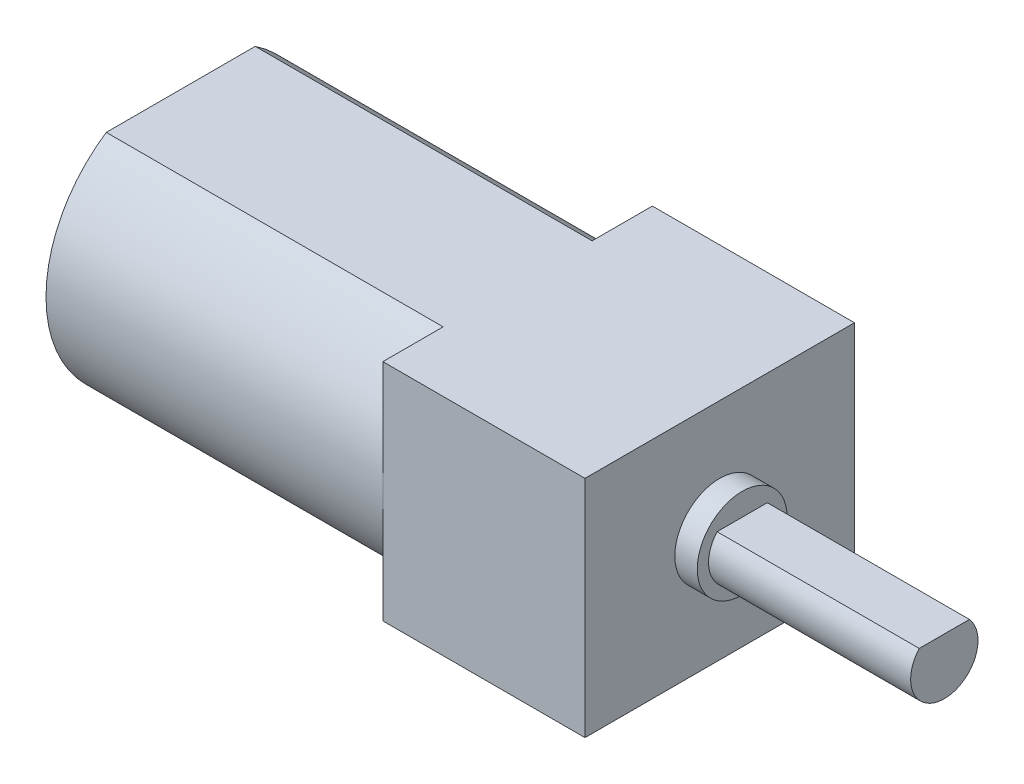
ISO-10303-21;
HEADER;
FILE_DESCRIPTION(('STEP AP214'),'2;1');
FILE_NAME('part.step','',(''),(''),'','','');
FILE_SCHEMA(('AUTOMOTIVE_DESIGN { 1 0 10303 214 1 1 1 1 }'));
ENDSEC;
DATA;
#1=APPLICATION_CONTEXT('core data for automotive mechanical design processes');
#2=APPLICATION_PROTOCOL_DEFINITION('international standard','automotive_design',2000,#1);
#3=PRODUCT_CONTEXT('',#1,'mechanical');
#4=PRODUCT('Part','Part','',(#3));
#5=PRODUCT_RELATED_PRODUCT_CATEGORY('part','',(#4));
#6=PRODUCT_DEFINITION_FORMATION('','',#4);
#7=PRODUCT_DEFINITION_CONTEXT('part definition',#1,'design');
#8=PRODUCT_DEFINITION('design','',#6,#7);
#9=PRODUCT_DEFINITION_SHAPE('','',#8);
#10=(LENGTH_UNIT() NAMED_UNIT(*) SI_UNIT(.MILLI.,.METRE.));
#11=(NAMED_UNIT(*) PLANE_ANGLE_UNIT() SI_UNIT($,.RADIAN.));
#12=(NAMED_UNIT(*) SI_UNIT($,.STERADIAN.) SOLID_ANGLE_UNIT());
#13=UNCERTAINTY_MEASURE_WITH_UNIT(LENGTH_MEASURE(1.E-05),#10,'distance_accuracy_value','');
#14=(GEOMETRIC_REPRESENTATION_CONTEXT(3) GLOBAL_UNCERTAINTY_ASSIGNED_CONTEXT((#13)) GLOBAL_UNIT_ASSIGNED_CONTEXT((#10,
#11,#12)) REPRESENTATION_CONTEXT('',''));
#15=CARTESIAN_POINT('',(0.,0.,0.));
#16=DIRECTION('',(0.,0.,1.));
#17=DIRECTION('',(1.,0.,0.));
#18=AXIS2_PLACEMENT_3D('',#15,#16,#17);
#19=CARTESIAN_POINT('',(13.,0.,0.));
#20=DIRECTION('',(1.,0.,0.));
#21=DIRECTION('',(0.,0.,-1.));
#22=AXIS2_PLACEMENT_3D('',#19,#20,#21);
#23=PLANE('',#22);
#24=CARTESIAN_POINT('',(13.,0.,0.));
#25=DIRECTION('',(1.,0.,0.));
#26=DIRECTION('',(0.,0.,-1.));
#27=AXIS2_PLACEMENT_3D('',#24,#25,#26);
#28=CIRCLE('',#27,2.);
#29=CARTESIAN_POINT('',(13.,0.,-2.));
#30=VERTEX_POINT('',#29);
#31=EDGE_CURVE('E161',#30,#30,#28,.T.);
#32=ORIENTED_EDGE('',*,*,#31,.T.);
#33=EDGE_LOOP('',(#32));
#34=FACE_BOUND('',#33,.T.);
#35=DIRECTION('',(0.,0.,-1.));
#36=VECTOR('',#35,1.);
#37=CARTESIAN_POINT('',(13.,1.,0.));
#38=LINE('',#37,#36);
#39=CARTESIAN_POINT('',(13.,1.,1.1180339887499));
#40=VERTEX_POINT('',#39);
#41=CARTESIAN_POINT('',(13.,1.,-1.11803398874989));
#42=VERTEX_POINT('',#41);
#43=EDGE_CURVE('E86',#40,#42,#38,.T.);
#44=ORIENTED_EDGE('',*,*,#43,.T.);
#45=CARTESIAN_POINT('',(13.,0.,0.));
#46=DIRECTION('',(1.,0.,0.));
#47=DIRECTION('',(0.,0.,-1.));
#48=AXIS2_PLACEMENT_3D('',#45,#46,#47);
#49=CIRCLE('',#48,1.5);
#50=EDGE_CURVE('E170',#40,#42,#49,.T.);
#51=ORIENTED_EDGE('',*,*,#50,.F.);
#52=EDGE_LOOP('',(#44,#51));
#53=FACE_BOUND('',#52,.T.);
#54=ADVANCED_FACE('F71',(#34,#53),#23,.T.);
#55=CARTESIAN_POINT('',(-12.,5.,-6.));
#56=DIRECTION('',(1.,0.,0.));
#57=DIRECTION('',(0.,0.,-1.));
#58=AXIS2_PLACEMENT_3D('',#55,#56,#57);
#59=PLANE('',#58);
#60=CARTESIAN_POINT('',(-12.,0.,0.));
#61=DIRECTION('',(1.,0.,0.));
#62=DIRECTION('',(0.,0.,-1.));
#63=AXIS2_PLACEMENT_3D('',#60,#61,#62);
#64=CIRCLE('',#63,2.5);
#65=CARTESIAN_POINT('',(-12.,0.,-2.5));
#66=VERTEX_POINT('',#65);
#67=EDGE_CURVE('E79',#66,#66,#64,.F.);
#68=ORIENTED_EDGE('',*,*,#67,.F.);
#69=EDGE_LOOP('',(#68));
#70=FACE_BOUND('',#69,.T.);
#71=DIRECTION('',(0.,0.,1.));
#72=VECTOR('',#71,1.);
#73=CARTESIAN_POINT('',(-12.,-5.,-6.));
#74=LINE('',#73,#72);
#75=CARTESIAN_POINT('',(-12.,-5.,-3.3166247903554));
#76=VERTEX_POINT('',#75);
#77=CARTESIAN_POINT('',(-12.,-5.,3.3166247903554));
#78=VERTEX_POINT('',#77);
#79=EDGE_CURVE('E243',#76,#78,#74,.T.);
#80=ORIENTED_EDGE('',*,*,#79,.T.);
#81=CARTESIAN_POINT('',(-12.,0.,0.));
#82=DIRECTION('',(-1.,0.,0.));
#83=DIRECTION('',(0.,0.,1.));
#84=AXIS2_PLACEMENT_3D('',#81,#82,#83);
#85=CIRCLE('',#84,6.);
#86=CARTESIAN_POINT('',(-12.,5.,3.3166247903554));
#87=VERTEX_POINT('',#86);
#88=EDGE_CURVE('E189',#78,#87,#85,.T.);
#89=ORIENTED_EDGE('',*,*,#88,.T.);
#90=DIRECTION('',(0.,0.,1.));
#91=VECTOR('',#90,1.);
#92=CARTESIAN_POINT('',(-12.,5.,-6.));
#93=LINE('',#92,#91);
#94=CARTESIAN_POINT('',(-12.,5.,-3.3166247903554));
#95=VERTEX_POINT('',#94);
#96=EDGE_CURVE('E232',#95,#87,#93,.T.);
#97=ORIENTED_EDGE('',*,*,#96,.F.);
#98=CARTESIAN_POINT('',(-12.,0.,0.));
#99=DIRECTION('',(-1.,0.,0.));
#100=DIRECTION('',(0.,0.,1.));
#101=AXIS2_PLACEMENT_3D('',#98,#99,#100);
#102=CIRCLE('',#101,6.);
#103=EDGE_CURVE('E211',#95,#76,#102,.T.);
#104=ORIENTED_EDGE('',*,*,#103,.T.);
#105=EDGE_LOOP('',(#80,#89,#97,#104));
#106=FACE_BOUND('',#105,.T.);
#107=ADVANCED_FACE('F256',(#70,#106),#59,.F.);
#108=CARTESIAN_POINT('',(0.,-5.,0.));
#109=DIRECTION('',(0.,1.,0.));
#110=DIRECTION('',(0.,0.,1.));
#111=AXIS2_PLACEMENT_3D('',#108,#109,#110);
#112=PLANE('',#111);
#113=DIRECTION('',(-1.,0.,0.));
#114=VECTOR('',#113,1.);
#115=CARTESIAN_POINT('',(3.,-5.,3.3166247903554));
#116=LINE('',#115,#114);
#117=CARTESIAN_POINT('',(3.,-5.,3.3166247903554));
#118=VERTEX_POINT('',#117);
#119=EDGE_CURVE('E181',#118,#78,#116,.T.);
#120=ORIENTED_EDGE('',*,*,#119,.T.);
#121=ORIENTED_EDGE('',*,*,#79,.F.);
#122=DIRECTION('',(-1.,0.,0.));
#123=VECTOR('',#122,1.);
#124=CARTESIAN_POINT('',(3.,-5.,-3.3166247903554));
#125=LINE('',#124,#123);
#126=CARTESIAN_POINT('',(3.,-5.,-3.3166247903554));
#127=VERTEX_POINT('',#126);
#128=EDGE_CURVE('E202',#127,#76,#125,.T.);
#129=ORIENTED_EDGE('',*,*,#128,.F.);
#130=DIRECTION('',(0.,0.,1.));
#131=VECTOR('',#130,1.);
#132=CARTESIAN_POINT('',(3.,-5.,0.));
#133=LINE('',#132,#131);
#134=CARTESIAN_POINT('',(3.,-5.,-6.));
#135=VERTEX_POINT('',#134);
#136=EDGE_CURVE('E201',#135,#127,#133,.T.);
#137=ORIENTED_EDGE('',*,*,#136,.F.);
#138=DIRECTION('',(-1.,0.,0.));
#139=VECTOR('',#138,1.);
#140=CARTESIAN_POINT('',(-12.,-5.,-6.));
#141=LINE('',#140,#139);
#142=CARTESIAN_POINT('',(12.,-5.,-6.));
#143=VERTEX_POINT('',#142);
#144=EDGE_CURVE('E240',#143,#135,#141,.T.);
#145=ORIENTED_EDGE('',*,*,#144,.F.);
#146=DIRECTION('',(0.,0.,-1.));
#147=VECTOR('',#146,1.);
#148=CARTESIAN_POINT('',(12.,-5.,-6.));
#149=LINE('',#148,#147);
#150=CARTESIAN_POINT('',(12.,-5.,6.));
#151=VERTEX_POINT('',#150);
#152=EDGE_CURVE('E224',#151,#143,#149,.T.);
#153=ORIENTED_EDGE('',*,*,#152,.F.);
#154=DIRECTION('',(1.,0.,0.));
#155=VECTOR('',#154,1.);
#156=CARTESIAN_POINT('',(-12.,-5.,6.));
#157=LINE('',#156,#155);
#158=CARTESIAN_POINT('',(3.,-5.,6.));
#159=VERTEX_POINT('',#158);
#160=EDGE_CURVE('E229',#159,#151,#157,.T.);
#161=ORIENTED_EDGE('',*,*,#160,.F.);
#162=DIRECTION('',(0.,0.,1.));
#163=VECTOR('',#162,1.);
#164=CARTESIAN_POINT('',(3.,-5.,0.));
#165=LINE('',#164,#163);
#166=EDGE_CURVE('E185',#118,#159,#165,.T.);
#167=ORIENTED_EDGE('',*,*,#166,.F.);
#168=EDGE_LOOP('',(#120,#121,#129,#137,#145,#153,#161,#167));
#169=FACE_BOUND('',#168,.T.);
#170=ADVANCED_FACE('F259',(#169),#112,.F.);
#171=CARTESIAN_POINT('',(-12.,5.,6.));
#172=DIRECTION('',(0.,0.,-1.));
#173=DIRECTION('',(-1.,0.,0.));
#174=AXIS2_PLACEMENT_3D('',#171,#172,#173);
#175=PLANE('',#174);
#176=DIRECTION('',(0.,1.,0.));
#177=VECTOR('',#176,1.);
#178=CARTESIAN_POINT('',(3.,0.,6.));
#179=LINE('',#178,#177);
#180=CARTESIAN_POINT('',(3.,0.,6.));
#181=VERTEX_POINT('',#180);
#182=EDGE_CURVE('E94',#159,#181,#179,.T.);
#183=ORIENTED_EDGE('',*,*,#182,.F.);
#184=ORIENTED_EDGE('',*,*,#160,.T.);
#185=DIRECTION('',(0.,-1.,0.));
#186=VECTOR('',#185,1.);
#187=CARTESIAN_POINT('',(12.,5.,6.));
#188=LINE('',#187,#186);
#189=CARTESIAN_POINT('',(12.,5.,6.));
#190=VERTEX_POINT('',#189);
#191=EDGE_CURVE('E237',#190,#151,#188,.T.);
#192=ORIENTED_EDGE('',*,*,#191,.F.);
#193=DIRECTION('',(1.,0.,0.));
#194=VECTOR('',#193,1.);
#195=CARTESIAN_POINT('',(-12.,5.,6.));
#196=LINE('',#195,#194);
#197=CARTESIAN_POINT('',(3.,5.,6.));
#198=VERTEX_POINT('',#197);
#199=EDGE_CURVE('E235',#198,#190,#196,.T.);
#200=ORIENTED_EDGE('',*,*,#199,.F.);
#201=DIRECTION('',(0.,1.,0.));
#202=VECTOR('',#201,1.);
#203=CARTESIAN_POINT('',(3.,0.,6.));
#204=LINE('',#203,#202);
#205=EDGE_CURVE('E192',#181,#198,#204,.T.);
#206=ORIENTED_EDGE('',*,*,#205,.F.);
#207=EDGE_LOOP('',(#183,#184,#192,#200,#206));
#208=FACE_BOUND('',#207,.T.);
#209=ADVANCED_FACE('F274',(#208),#175,.F.);
#210=CARTESIAN_POINT('',(0.,5.,0.));
#211=DIRECTION('',(0.,1.,0.));
#212=DIRECTION('',(0.,0.,1.));
#213=AXIS2_PLACEMENT_3D('',#210,#211,#212);
#214=PLANE('',#213);
#215=ORIENTED_EDGE('',*,*,#96,.T.);
#216=DIRECTION('',(-1.,0.,0.));
#217=VECTOR('',#216,1.);
#218=CARTESIAN_POINT('',(3.,5.,3.3166247903554));
#219=LINE('',#218,#217);
#220=CARTESIAN_POINT('',(3.,5.,3.3166247903554));
#221=VERTEX_POINT('',#220);
#222=EDGE_CURVE('E197',#221,#87,#219,.T.);
#223=ORIENTED_EDGE('',*,*,#222,.F.);
#224=DIRECTION('',(0.,0.,-1.));
#225=VECTOR('',#224,1.);
#226=CARTESIAN_POINT('',(3.,5.,0.));
#227=LINE('',#226,#225);
#228=EDGE_CURVE('E194',#198,#221,#227,.T.);
#229=ORIENTED_EDGE('',*,*,#228,.F.);
#230=ORIENTED_EDGE('',*,*,#199,.T.);
#231=DIRECTION('',(0.,0.,-1.));
#232=VECTOR('',#231,1.);
#233=CARTESIAN_POINT('',(12.,5.,-6.));
#234=LINE('',#233,#232);
#235=CARTESIAN_POINT('',(12.,5.,-6.));
#236=VERTEX_POINT('',#235);
#237=EDGE_CURVE('E225',#190,#236,#234,.T.);
#238=ORIENTED_EDGE('',*,*,#237,.T.);
#239=DIRECTION('',(-1.,0.,0.));
#240=VECTOR('',#239,1.);
#241=CARTESIAN_POINT('',(-12.,5.,-6.));
#242=LINE('',#241,#240);
#243=CARTESIAN_POINT('',(3.,5.,-6.));
#244=VERTEX_POINT('',#243);
#245=EDGE_CURVE('E228',#236,#244,#242,.T.);
#246=ORIENTED_EDGE('',*,*,#245,.T.);
#247=DIRECTION('',(0.,0.,-1.));
#248=VECTOR('',#247,1.);
#249=CARTESIAN_POINT('',(3.,5.,0.));
#250=LINE('',#249,#248);
#251=CARTESIAN_POINT('',(3.,5.,-3.3166247903554));
#252=VERTEX_POINT('',#251);
#253=EDGE_CURVE('E215',#252,#244,#250,.T.);
#254=ORIENTED_EDGE('',*,*,#253,.F.);
#255=DIRECTION('',(-1.,0.,0.));
#256=VECTOR('',#255,1.);
#257=CARTESIAN_POINT('',(3.,5.,-3.3166247903554));
#258=LINE('',#257,#256);
#259=EDGE_CURVE('E220',#252,#95,#258,.T.);
#260=ORIENTED_EDGE('',*,*,#259,.T.);
#261=EDGE_LOOP('',(#215,#223,#229,#230,#238,#246,#254,#260));
#262=FACE_BOUND('',#261,.T.);
#263=ADVANCED_FACE('F283',(#262),#214,.T.);
#264=CARTESIAN_POINT('',(-12.,5.,-6.));
#265=DIRECTION('',(0.,0.,1.));
#266=DIRECTION('',(1.,0.,0.));
#267=AXIS2_PLACEMENT_3D('',#264,#265,#266);
#268=PLANE('',#267);
#269=DIRECTION('',(0.,-1.,0.));
#270=VECTOR('',#269,1.);
#271=CARTESIAN_POINT('',(3.,0.,-6.));
#272=LINE('',#271,#270);
#273=CARTESIAN_POINT('',(3.,0.,-6.));
#274=VERTEX_POINT('',#273);
#275=EDGE_CURVE('E205',#274,#135,#272,.T.);
#276=ORIENTED_EDGE('',*,*,#275,.F.);
#277=DIRECTION('',(0.,-1.,0.));
#278=VECTOR('',#277,1.);
#279=CARTESIAN_POINT('',(3.,0.,-6.));
#280=LINE('',#279,#278);
#281=EDGE_CURVE('E217',#244,#274,#280,.T.);
#282=ORIENTED_EDGE('',*,*,#281,.F.);
#283=ORIENTED_EDGE('',*,*,#245,.F.);
#284=DIRECTION('',(0.,-1.,0.));
#285=VECTOR('',#284,1.);
#286=CARTESIAN_POINT('',(12.,5.,-6.));
#287=LINE('',#286,#285);
#288=EDGE_CURVE('E249',#236,#143,#287,.T.);
#289=ORIENTED_EDGE('',*,*,#288,.T.);
#290=ORIENTED_EDGE('',*,*,#144,.T.);
#291=EDGE_LOOP('',(#276,#282,#283,#289,#290));
#292=FACE_BOUND('',#291,.T.);
#293=ADVANCED_FACE('F413',(#292),#268,.F.);
#294=CARTESIAN_POINT('',(12.,5.,-6.));
#295=DIRECTION('',(-1.,0.,0.));
#296=DIRECTION('',(0.,0.,1.));
#297=AXIS2_PLACEMENT_3D('',#294,#295,#296);
#298=PLANE('',#297);
#299=CARTESIAN_POINT('',(12.,0.,0.));
#300=DIRECTION('',(-1.,0.,0.));
#301=DIRECTION('',(0.,0.,1.));
#302=AXIS2_PLACEMENT_3D('',#299,#300,#301);
#303=CIRCLE('',#302,2.);
#304=CARTESIAN_POINT('',(12.,0.,2.));
#305=VERTEX_POINT('',#304);
#306=EDGE_CURVE('E12',#305,#305,#303,.F.);
#307=ORIENTED_EDGE('',*,*,#306,.F.);
#308=EDGE_LOOP('',(#307));
#309=FACE_BOUND('',#308,.T.);
#310=ORIENTED_EDGE('',*,*,#152,.T.);
#311=ORIENTED_EDGE('',*,*,#288,.F.);
#312=ORIENTED_EDGE('',*,*,#237,.F.);
#313=ORIENTED_EDGE('',*,*,#191,.T.);
#314=EDGE_LOOP('',(#310,#311,#312,#313));
#315=FACE_BOUND('',#314,.T.);
#316=ADVANCED_FACE('F73',(#309,#315),#298,.F.);
#317=CARTESIAN_POINT('',(3.,0.,0.));
#318=DIRECTION('',(-1.,0.,0.));
#319=DIRECTION('',(0.,0.,1.));
#320=AXIS2_PLACEMENT_3D('',#317,#318,#319);
#321=CYLINDRICAL_SURFACE('',#320,6.);
#322=ORIENTED_EDGE('',*,*,#103,.F.);
#323=ORIENTED_EDGE('',*,*,#259,.F.);
#324=CARTESIAN_POINT('',(3.,0.,0.));
#325=DIRECTION('',(-1.,0.,0.));
#326=DIRECTION('',(0.,0.,1.));
#327=AXIS2_PLACEMENT_3D('',#324,#325,#326);
#328=CIRCLE('',#327,6.);
#329=EDGE_CURVE('E212',#252,#274,#328,.T.);
#330=ORIENTED_EDGE('',*,*,#329,.T.);
#331=CARTESIAN_POINT('',(3.,0.,0.));
#332=DIRECTION('',(-1.,0.,0.));
#333=DIRECTION('',(0.,0.,1.));
#334=AXIS2_PLACEMENT_3D('',#331,#332,#333);
#335=CIRCLE('',#334,6.);
#336=EDGE_CURVE('E209',#274,#127,#335,.T.);
#337=ORIENTED_EDGE('',*,*,#336,.T.);
#338=ORIENTED_EDGE('',*,*,#128,.T.);
#339=EDGE_LOOP('',(#322,#323,#330,#337,#338));
#340=FACE_BOUND('',#339,.T.);
#341=ADVANCED_FACE('F396',(#340),#321,.T.);
#342=CARTESIAN_POINT('',(3.,0.,0.));
#343=DIRECTION('',(-1.,0.,0.));
#344=DIRECTION('',(0.,0.,1.));
#345=AXIS2_PLACEMENT_3D('',#342,#343,#344);
#346=PLANE('',#345);
#347=ORIENTED_EDGE('',*,*,#329,.F.);
#348=ORIENTED_EDGE('',*,*,#253,.T.);
#349=ORIENTED_EDGE('',*,*,#281,.T.);
#350=EDGE_LOOP('',(#347,#348,#349));
#351=FACE_BOUND('',#350,.T.);
#352=ADVANCED_FACE('F386',(#351),#346,.T.);
#353=CARTESIAN_POINT('',(3.,0.,0.));
#354=DIRECTION('',(-1.,0.,0.));
#355=DIRECTION('',(0.,0.,1.));
#356=AXIS2_PLACEMENT_3D('',#353,#354,#355);
#357=PLANE('',#356);
#358=ORIENTED_EDGE('',*,*,#336,.F.);
#359=ORIENTED_EDGE('',*,*,#275,.T.);
#360=ORIENTED_EDGE('',*,*,#136,.T.);
#361=EDGE_LOOP('',(#358,#359,#360));
#362=FACE_BOUND('',#361,.T.);
#363=ADVANCED_FACE('F294',(#362),#357,.T.);
#364=CARTESIAN_POINT('',(3.,0.,0.));
#365=DIRECTION('',(-1.,0.,0.));
#366=DIRECTION('',(0.,0.,1.));
#367=AXIS2_PLACEMENT_3D('',#364,#365,#366);
#368=CYLINDRICAL_SURFACE('',#367,6.);
#369=ORIENTED_EDGE('',*,*,#88,.F.);
#370=ORIENTED_EDGE('',*,*,#119,.F.);
#371=CARTESIAN_POINT('',(3.,0.,0.));
#372=DIRECTION('',(-1.,0.,0.));
#373=DIRECTION('',(0.,0.,1.));
#374=AXIS2_PLACEMENT_3D('',#371,#372,#373);
#375=CIRCLE('',#374,6.);
#376=EDGE_CURVE('E187',#118,#181,#375,.T.);
#377=ORIENTED_EDGE('',*,*,#376,.T.);
#378=CARTESIAN_POINT('',(3.,0.,0.));
#379=DIRECTION('',(-1.,0.,0.));
#380=DIRECTION('',(0.,0.,1.));
#381=AXIS2_PLACEMENT_3D('',#378,#379,#380);
#382=CIRCLE('',#381,6.);
#383=EDGE_CURVE('E190',#181,#221,#382,.T.);
#384=ORIENTED_EDGE('',*,*,#383,.T.);
#385=ORIENTED_EDGE('',*,*,#222,.T.);
#386=EDGE_LOOP('',(#369,#370,#377,#384,#385));
#387=FACE_BOUND('',#386,.T.);
#388=ADVANCED_FACE('F269',(#387),#368,.T.);
#389=CARTESIAN_POINT('',(3.,0.,0.));
#390=DIRECTION('',(-1.,0.,0.));
#391=DIRECTION('',(0.,0.,1.));
#392=AXIS2_PLACEMENT_3D('',#389,#390,#391);
#393=PLANE('',#392);
#394=ORIENTED_EDGE('',*,*,#383,.F.);
#395=ORIENTED_EDGE('',*,*,#205,.T.);
#396=ORIENTED_EDGE('',*,*,#228,.T.);
#397=EDGE_LOOP('',(#394,#395,#396));
#398=FACE_BOUND('',#397,.T.);
#399=ADVANCED_FACE('F286',(#398),#393,.T.);
#400=CARTESIAN_POINT('',(3.,0.,0.));
#401=DIRECTION('',(-1.,0.,0.));
#402=DIRECTION('',(0.,0.,1.));
#403=AXIS2_PLACEMENT_3D('',#400,#401,#402);
#404=PLANE('',#403);
#405=ORIENTED_EDGE('',*,*,#376,.F.);
#406=ORIENTED_EDGE('',*,*,#166,.T.);
#407=ORIENTED_EDGE('',*,*,#182,.T.);
#408=EDGE_LOOP('',(#405,#406,#407));
#409=FACE_BOUND('',#408,.T.);
#410=ADVANCED_FACE('F271',(#409),#404,.T.);
#411=CARTESIAN_POINT('',(-13.5,0.,0.));
#412=DIRECTION('',(1.,0.,0.));
#413=DIRECTION('',(0.,0.,-1.));
#414=AXIS2_PLACEMENT_3D('',#411,#412,#413);
#415=CYLINDRICAL_SURFACE('',#414,2.5);
#416=CARTESIAN_POINT('',(-13.5,0.,0.));
#417=DIRECTION('',(-1.,0.,0.));
#418=DIRECTION('',(0.,0.,1.));
#419=AXIS2_PLACEMENT_3D('',#416,#417,#418);
#420=CIRCLE('',#419,2.5);
#421=CARTESIAN_POINT('',(-13.5,0.,2.5));
#422=VERTEX_POINT('',#421);
#423=EDGE_CURVE('E178',#422,#422,#420,.T.);
#424=ORIENTED_EDGE('',*,*,#423,.F.);
#425=EDGE_LOOP('',(#424));
#426=FACE_BOUND('',#425,.T.);
#427=ORIENTED_EDGE('',*,*,#67,.T.);
#428=EDGE_LOOP('',(#427));
#429=FACE_BOUND('',#428,.T.);
#430=ADVANCED_FACE('F254',(#426,#429),#415,.T.);
#431=CARTESIAN_POINT('',(-13.5,0.,0.));
#432=DIRECTION('',(-1.,0.,0.));
#433=DIRECTION('',(0.,0.,1.));
#434=AXIS2_PLACEMENT_3D('',#431,#432,#433);
#435=PLANE('',#434);
#436=ORIENTED_EDGE('',*,*,#423,.T.);
#437=EDGE_LOOP('',(#436));
#438=FACE_BOUND('',#437,.T.);
#439=ADVANCED_FACE('F308',(#438),#435,.T.);
#440=CARTESIAN_POINT('',(13.,0.,0.));
#441=DIRECTION('',(-1.,0.,0.));
#442=DIRECTION('',(0.,0.,1.));
#443=AXIS2_PLACEMENT_3D('',#440,#441,#442);
#444=CYLINDRICAL_SURFACE('',#443,2.);
#445=ORIENTED_EDGE('',*,*,#31,.F.);
#446=EDGE_LOOP('',(#445));
#447=FACE_BOUND('',#446,.T.);
#448=ORIENTED_EDGE('',*,*,#306,.T.);
#449=EDGE_LOOP('',(#448));
#450=FACE_BOUND('',#449,.T.);
#451=ADVANCED_FACE('F305',(#447,#450),#444,.T.);
#452=CARTESIAN_POINT('',(22.,1.,0.));
#453=DIRECTION('',(0.,1.,0.));
#454=DIRECTION('',(0.,0.,1.));
#455=AXIS2_PLACEMENT_3D('',#452,#453,#454);
#456=PLANE('',#455);
#457=ORIENTED_EDGE('',*,*,#43,.F.);
#458=DIRECTION('',(-1.,0.,0.));
#459=VECTOR('',#458,1.);
#460=CARTESIAN_POINT('',(22.,1.,1.11803398874989));
#461=LINE('',#460,#459);
#462=CARTESIAN_POINT('',(22.,1.,1.11803398874989));
#463=VERTEX_POINT('',#462);
#464=EDGE_CURVE('E153',#463,#40,#461,.T.);
#465=ORIENTED_EDGE('',*,*,#464,.F.);
#466=DIRECTION('',(0.,0.,-1.));
#467=VECTOR('',#466,1.);
#468=CARTESIAN_POINT('',(22.,1.,0.));
#469=LINE('',#468,#467);
#470=CARTESIAN_POINT('',(22.,1.,-1.11803398874989));
#471=VERTEX_POINT('',#470);
#472=EDGE_CURVE('E157',#463,#471,#469,.T.);
#473=ORIENTED_EDGE('',*,*,#472,.T.);
#474=DIRECTION('',(-1.,0.,0.));
#475=VECTOR('',#474,1.);
#476=CARTESIAN_POINT('',(22.,1.,-1.11803398874989));
#477=LINE('',#476,#475);
#478=EDGE_CURVE('E162',#471,#42,#477,.T.);
#479=ORIENTED_EDGE('',*,*,#478,.T.);
#480=EDGE_LOOP('',(#457,#465,#473,#479));
#481=FACE_BOUND('',#480,.T.);
#482=ADVANCED_FACE('F155',(#481),#456,.T.);
#483=CARTESIAN_POINT('',(22.,0.,0.));
#484=DIRECTION('',(-1.,0.,0.));
#485=DIRECTION('',(0.,0.,1.));
#486=AXIS2_PLACEMENT_3D('',#483,#484,#485);
#487=CYLINDRICAL_SURFACE('',#486,1.5);
#488=ORIENTED_EDGE('',*,*,#50,.T.);
#489=ORIENTED_EDGE('',*,*,#478,.F.);
#490=CARTESIAN_POINT('',(22.,0.,0.));
#491=DIRECTION('',(1.,0.,0.));
#492=DIRECTION('',(0.,0.,-1.));
#493=AXIS2_PLACEMENT_3D('',#490,#491,#492);
#494=CIRCLE('',#493,1.5);
#495=EDGE_CURVE('E165',#463,#471,#494,.T.);
#496=ORIENTED_EDGE('',*,*,#495,.F.);
#497=ORIENTED_EDGE('',*,*,#464,.T.);
#498=EDGE_LOOP('',(#488,#489,#496,#497));
#499=FACE_BOUND('',#498,.T.);
#500=ADVANCED_FACE('F166',(#499),#487,.T.);
#501=CARTESIAN_POINT('',(22.,0.,0.));
#502=DIRECTION('',(1.,0.,0.));
#503=DIRECTION('',(0.,0.,-1.));
#504=AXIS2_PLACEMENT_3D('',#501,#502,#503);
#505=PLANE('',#504);
#506=ORIENTED_EDGE('',*,*,#472,.F.);
#507=ORIENTED_EDGE('',*,*,#495,.T.);
#508=EDGE_LOOP('',(#506,#507));
#509=FACE_BOUND('',#508,.T.);
#510=ADVANCED_FACE('F169',(#509),#505,.T.);
#511=CLOSED_SHELL('',(#54,#107,#170,#209,#263,#293,#316,#341,#352,#363,#388,#399,#410,#430,#439,
#451,#482,#500,#510));
#512=MANIFOLD_SOLID_BREP('B2',#511);
#513=ADVANCED_BREP_SHAPE_REPRESENTATION('',(#18,#512),#14);
#514=SHAPE_DEFINITION_REPRESENTATION(#9,#513);
ENDSEC;
END-ISO-10303-21;
